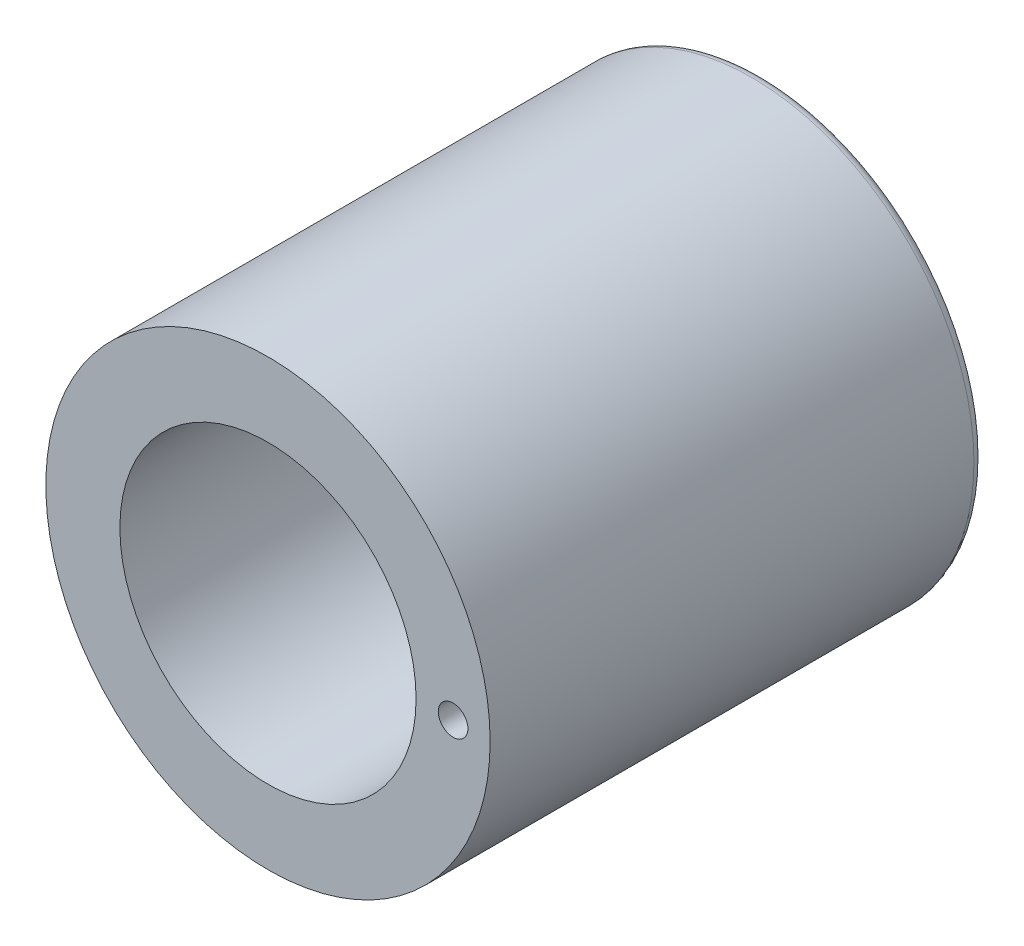
ISO-10303-21;
HEADER;
FILE_DESCRIPTION(('STEP AP214'),'2;1');
FILE_NAME('part.step','',(''),(''),'','','');
FILE_SCHEMA(('AUTOMOTIVE_DESIGN { 1 0 10303 214 1 1 1 1 }'));
ENDSEC;
DATA;
#1=APPLICATION_CONTEXT('core data for automotive mechanical design processes');
#2=APPLICATION_PROTOCOL_DEFINITION('international standard','automotive_design',2000,#1);
#3=PRODUCT_CONTEXT('',#1,'mechanical');
#4=PRODUCT('Part','Part','',(#3));
#5=PRODUCT_RELATED_PRODUCT_CATEGORY('part','',(#4));
#6=PRODUCT_DEFINITION_FORMATION('','',#4);
#7=PRODUCT_DEFINITION_CONTEXT('part definition',#1,'design');
#8=PRODUCT_DEFINITION('design','',#6,#7);
#9=PRODUCT_DEFINITION_SHAPE('','',#8);
#10=(LENGTH_UNIT() NAMED_UNIT(*) SI_UNIT(.MILLI.,.METRE.));
#11=(NAMED_UNIT(*) PLANE_ANGLE_UNIT() SI_UNIT($,.RADIAN.));
#12=(NAMED_UNIT(*) SI_UNIT($,.STERADIAN.) SOLID_ANGLE_UNIT());
#13=UNCERTAINTY_MEASURE_WITH_UNIT(LENGTH_MEASURE(1.E-05),#10,'distance_accuracy_value','');
#14=(GEOMETRIC_REPRESENTATION_CONTEXT(3) GLOBAL_UNCERTAINTY_ASSIGNED_CONTEXT((#13)) GLOBAL_UNIT_ASSIGNED_CONTEXT((#10,
#11,#12)) REPRESENTATION_CONTEXT('',''));
#15=CARTESIAN_POINT('',(0.,0.,0.));
#16=DIRECTION('',(0.,0.,1.));
#17=DIRECTION('',(1.,0.,0.));
#18=AXIS2_PLACEMENT_3D('',#15,#16,#17);
#19=CARTESIAN_POINT('',(0.,0.,100.));
#20=DIRECTION('',(0.,0.,-1.));
#21=DIRECTION('',(-1.,0.,0.));
#22=AXIS2_PLACEMENT_3D('',#19,#20,#21);
#23=CYLINDRICAL_SURFACE('',#22,45.);
#24=CARTESIAN_POINT('',(0.,0.,2.));
#25=DIRECTION('',(0.,0.,1.));
#26=DIRECTION('',(1.,0.,0.));
#27=AXIS2_PLACEMENT_3D('',#24,#25,#26);
#28=CIRCLE('',#27,45.);
#29=CARTESIAN_POINT('',(45.,0.,2.));
#30=VERTEX_POINT('',#29);
#31=EDGE_CURVE('E37',#30,#30,#28,.T.);
#32=ORIENTED_EDGE('',*,*,#31,.T.);
#33=EDGE_LOOP('',(#32));
#34=FACE_BOUND('',#33,.T.);
#35=CARTESIAN_POINT('',(0.,0.,100.));
#36=DIRECTION('',(0.,0.,1.));
#37=DIRECTION('',(1.,0.,0.));
#38=AXIS2_PLACEMENT_3D('',#35,#36,#37);
#39=CIRCLE('',#38,45.);
#40=CARTESIAN_POINT('',(45.,0.,100.));
#41=VERTEX_POINT('',#40);
#42=EDGE_CURVE('E41',#41,#41,#39,.T.);
#43=ORIENTED_EDGE('',*,*,#42,.F.);
#44=EDGE_LOOP('',(#43));
#45=FACE_BOUND('',#44,.T.);
#46=ADVANCED_FACE('F31',(#34,#45),#23,.T.);
#47=CARTESIAN_POINT('',(0.,0.,100.));
#48=DIRECTION('',(0.,0.,1.));
#49=DIRECTION('',(1.,0.,0.));
#50=AXIS2_PLACEMENT_3D('',#47,#48,#49);
#51=PLANE('',#50);
#52=CARTESIAN_POINT('',(37.5,0.,100.));
#53=DIRECTION('',(0.,0.,1.));
#54=DIRECTION('',(1.,0.,0.));
#55=AXIS2_PLACEMENT_3D('',#52,#53,#54);
#56=CIRCLE('',#55,3.);
#57=CARTESIAN_POINT('',(40.5,0.,100.));
#58=VERTEX_POINT('',#57);
#59=EDGE_CURVE('E56',#58,#58,#56,.T.);
#60=ORIENTED_EDGE('',*,*,#59,.F.);
#61=EDGE_LOOP('',(#60));
#62=FACE_BOUND('',#61,.T.);
#63=CARTESIAN_POINT('',(0.,0.,100.));
#64=DIRECTION('',(0.,0.,1.));
#65=DIRECTION('',(1.,0.,0.));
#66=AXIS2_PLACEMENT_3D('',#63,#64,#65);
#67=CIRCLE('',#66,30.);
#68=CARTESIAN_POINT('',(30.,0.,100.));
#69=VERTEX_POINT('',#68);
#70=EDGE_CURVE('E50',#69,#69,#67,.T.);
#71=ORIENTED_EDGE('',*,*,#70,.F.);
#72=EDGE_LOOP('',(#71));
#73=FACE_BOUND('',#72,.T.);
#74=ORIENTED_EDGE('',*,*,#42,.T.);
#75=EDGE_LOOP('',(#74));
#76=FACE_BOUND('',#75,.T.);
#77=ADVANCED_FACE('F62',(#62,#73,#76),#51,.T.);
#78=CARTESIAN_POINT('',(0.,0.,0.));
#79=DIRECTION('',(0.,0.,1.));
#80=DIRECTION('',(1.,0.,0.));
#81=AXIS2_PLACEMENT_3D('',#78,#79,#80);
#82=PLANE('',#81);
#83=CARTESIAN_POINT('',(0.,0.,0.));
#84=DIRECTION('',(0.,0.,1.));
#85=DIRECTION('',(1.,0.,0.));
#86=AXIS2_PLACEMENT_3D('',#83,#84,#85);
#87=CIRCLE('',#86,43.);
#88=CARTESIAN_POINT('',(43.,0.,0.));
#89=VERTEX_POINT('',#88);
#90=EDGE_CURVE('E10',#89,#89,#87,.F.);
#91=ORIENTED_EDGE('',*,*,#90,.T.);
#92=EDGE_LOOP('',(#91));
#93=FACE_BOUND('',#92,.T.);
#94=CARTESIAN_POINT('',(0.,0.,0.));
#95=DIRECTION('',(0.,0.,1.));
#96=DIRECTION('',(1.,0.,0.));
#97=AXIS2_PLACEMENT_3D('',#94,#95,#96);
#98=CIRCLE('',#97,30.);
#99=CARTESIAN_POINT('',(30.,0.,0.));
#100=VERTEX_POINT('',#99);
#101=EDGE_CURVE('E45',#100,#100,#98,.T.);
#102=ORIENTED_EDGE('',*,*,#101,.T.);
#103=EDGE_LOOP('',(#102));
#104=FACE_BOUND('',#103,.T.);
#105=ADVANCED_FACE('F65',(#93,#104),#82,.F.);
#106=CARTESIAN_POINT('',(0.,0.,0.));
#107=DIRECTION('',(0.,0.,1.));
#108=DIRECTION('',(1.,0.,0.));
#109=AXIS2_PLACEMENT_3D('',#106,#107,#108);
#110=CYLINDRICAL_SURFACE('',#109,30.);
#111=ORIENTED_EDGE('',*,*,#101,.F.);
#112=EDGE_LOOP('',(#111));
#113=FACE_BOUND('',#112,.T.);
#114=ORIENTED_EDGE('',*,*,#70,.T.);
#115=EDGE_LOOP('',(#114));
#116=FACE_BOUND('',#115,.T.);
#117=ADVANCED_FACE('F83',(#113,#116),#110,.F.);
#118=CARTESIAN_POINT('',(37.5,0.,70.0000000000001));
#119=DIRECTION('',(0.,0.,1.));
#120=DIRECTION('',(1.,0.,0.));
#121=AXIS2_PLACEMENT_3D('',#118,#119,#120);
#122=CYLINDRICAL_SURFACE('',#121,3.);
#123=CARTESIAN_POINT('',(37.5,0.,70.0000000000001));
#124=DIRECTION('',(0.,0.,1.));
#125=DIRECTION('',(1.,0.,0.));
#126=AXIS2_PLACEMENT_3D('',#123,#124,#125);
#127=CIRCLE('',#126,3.);
#128=CARTESIAN_POINT('',(40.5,0.,70.0000000000001));
#129=VERTEX_POINT('',#128);
#130=EDGE_CURVE('E53',#129,#129,#127,.T.);
#131=ORIENTED_EDGE('',*,*,#130,.F.);
#132=EDGE_LOOP('',(#131));
#133=FACE_BOUND('',#132,.T.);
#134=ORIENTED_EDGE('',*,*,#59,.T.);
#135=EDGE_LOOP('',(#134));
#136=FACE_BOUND('',#135,.T.);
#137=ADVANCED_FACE('F60',(#133,#136),#122,.F.);
#138=CARTESIAN_POINT('',(37.5,0.,70.0000000000001));
#139=DIRECTION('',(0.,0.,1.));
#140=DIRECTION('',(1.,0.,0.));
#141=AXIS2_PLACEMENT_3D('',#138,#139,#140);
#142=PLANE('',#141);
#143=ORIENTED_EDGE('',*,*,#130,.T.);
#144=EDGE_LOOP('',(#143));
#145=FACE_BOUND('',#144,.T.);
#146=ADVANCED_FACE('F97',(#145),#142,.T.);
#147=CARTESIAN_POINT('',(0.,0.,2.));
#148=DIRECTION('',(0.,0.,1.));
#149=DIRECTION('',(1.,0.,0.));
#150=AXIS2_PLACEMENT_3D('',#147,#148,#149);
#151=TOROIDAL_SURFACE('',#150,43.,2.);
#152=ORIENTED_EDGE('',*,*,#90,.F.);
#153=EDGE_LOOP('',(#152));
#154=FACE_BOUND('',#153,.T.);
#155=ORIENTED_EDGE('',*,*,#31,.F.);
#156=EDGE_LOOP('',(#155));
#157=FACE_BOUND('',#156,.T.);
#158=ADVANCED_FACE('F105',(#154,#157),#151,.T.);
#159=CLOSED_SHELL('',(#46,#77,#105,#117,#137,#146,#158));
#160=MANIFOLD_SOLID_BREP('B2',#159);
#161=ADVANCED_BREP_SHAPE_REPRESENTATION('',(#18,#160),#14);
#162=SHAPE_DEFINITION_REPRESENTATION(#9,#161);
ENDSEC;
END-ISO-10303-21;
